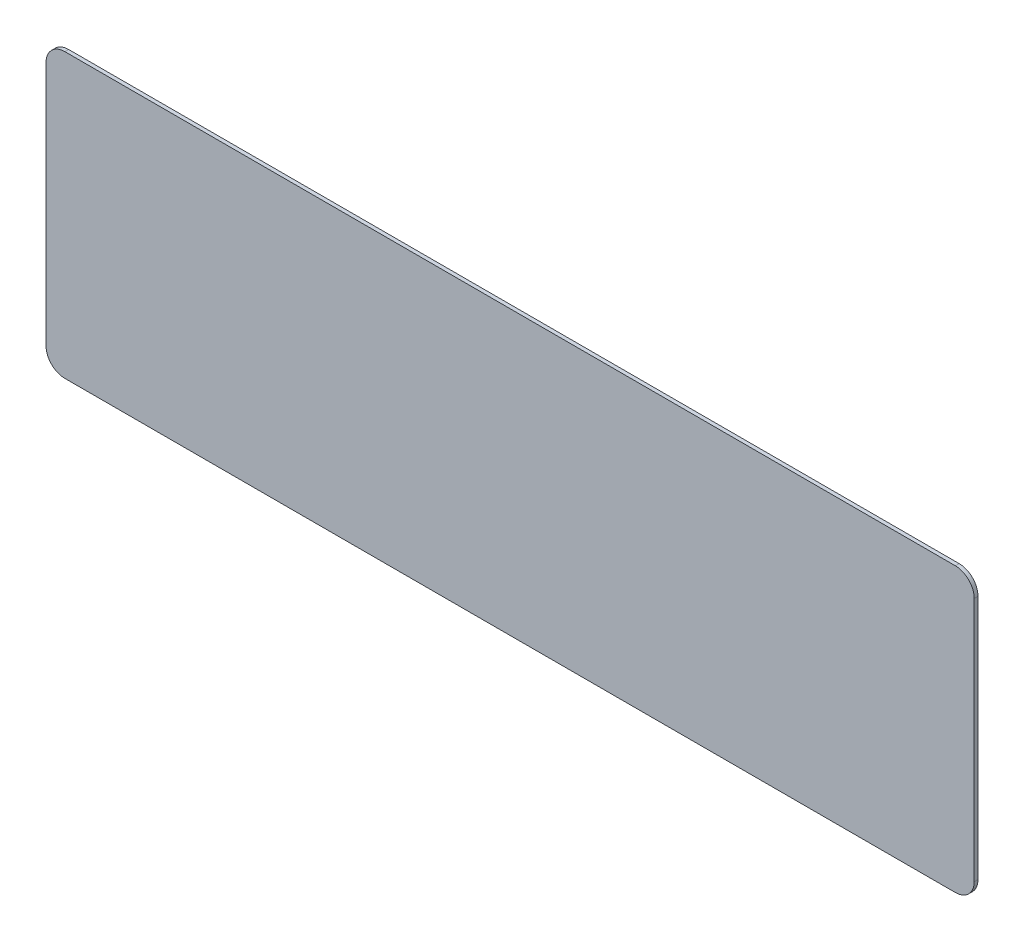
ISO-10303-21;
HEADER;
FILE_DESCRIPTION(('STEP AP214'),'2;1');
FILE_NAME('part.step','',(''),(''),'','','');
FILE_SCHEMA(('AUTOMOTIVE_DESIGN { 1 0 10303 214 1 1 1 1 }'));
ENDSEC;
DATA;
#1=APPLICATION_CONTEXT('core data for automotive mechanical design processes');
#2=APPLICATION_PROTOCOL_DEFINITION('international standard','automotive_design',2000,#1);
#3=PRODUCT_CONTEXT('',#1,'mechanical');
#4=PRODUCT('Part','Part','',(#3));
#5=PRODUCT_RELATED_PRODUCT_CATEGORY('part','',(#4));
#6=PRODUCT_DEFINITION_FORMATION('','',#4);
#7=PRODUCT_DEFINITION_CONTEXT('part definition',#1,'design');
#8=PRODUCT_DEFINITION('design','',#6,#7);
#9=PRODUCT_DEFINITION_SHAPE('','',#8);
#10=(LENGTH_UNIT() NAMED_UNIT(*) SI_UNIT(.MILLI.,.METRE.));
#11=(NAMED_UNIT(*) PLANE_ANGLE_UNIT() SI_UNIT($,.RADIAN.));
#12=(NAMED_UNIT(*) SI_UNIT($,.STERADIAN.) SOLID_ANGLE_UNIT());
#13=UNCERTAINTY_MEASURE_WITH_UNIT(LENGTH_MEASURE(1.E-05),#10,'distance_accuracy_value','');
#14=(GEOMETRIC_REPRESENTATION_CONTEXT(3) GLOBAL_UNCERTAINTY_ASSIGNED_CONTEXT((#13)) GLOBAL_UNIT_ASSIGNED_CONTEXT((#10,
#11,#12)) REPRESENTATION_CONTEXT('',''));
#15=CARTESIAN_POINT('',(0.,0.,0.));
#16=DIRECTION('',(0.,0.,1.));
#17=DIRECTION('',(1.,0.,0.));
#18=AXIS2_PLACEMENT_3D('',#15,#16,#17);
#19=CARTESIAN_POINT('',(-123.000000000036,-367.000000000029,2.));
#20=DIRECTION('',(0.,1.,0.));
#21=DIRECTION('',(0.,0.,1.));
#22=AXIS2_PLACEMENT_3D('',#19,#20,#21);
#23=PLANE('',#22);
#24=DIRECTION('',(1.,0.,0.));
#25=VECTOR('',#24,1.);
#26=CARTESIAN_POINT('',(-123.000000000036,-367.000000000029,2.));
#27=LINE('',#26,#25);
#28=CARTESIAN_POINT('',(-113.000000000036,-367.000000000029,2.));
#29=VERTEX_POINT('',#28);
#30=CARTESIAN_POINT('',(358.999999999964,-367.000000000029,2.));
#31=VERTEX_POINT('',#30);
#32=EDGE_CURVE('E125',#29,#31,#27,.T.);
#33=ORIENTED_EDGE('',*,*,#32,.F.);
#34=DIRECTION('',(0.,0.,-1.));
#35=VECTOR('',#34,1.);
#36=CARTESIAN_POINT('',(-113.000000000036,-367.000000000029,0.));
#37=LINE('',#36,#35);
#38=CARTESIAN_POINT('',(-113.000000000036,-367.000000000029,0.));
#39=VERTEX_POINT('',#38);
#40=EDGE_CURVE('E110',#29,#39,#37,.T.);
#41=ORIENTED_EDGE('',*,*,#40,.T.);
#42=DIRECTION('',(1.,0.,0.));
#43=VECTOR('',#42,1.);
#44=CARTESIAN_POINT('',(-123.000000000036,-367.000000000029,0.));
#45=LINE('',#44,#43);
#46=CARTESIAN_POINT('',(358.999999999964,-367.000000000029,0.));
#47=VERTEX_POINT('',#46);
#48=EDGE_CURVE('E122',#39,#47,#45,.T.);
#49=ORIENTED_EDGE('',*,*,#48,.T.);
#50=DIRECTION('',(0.,0.,-1.));
#51=VECTOR('',#50,1.);
#52=CARTESIAN_POINT('',(358.999999999964,-367.000000000029,2.));
#53=LINE('',#52,#51);
#54=EDGE_CURVE('E127',#47,#31,#53,.F.);
#55=ORIENTED_EDGE('',*,*,#54,.T.);
#56=EDGE_LOOP('',(#33,#41,#49,#55));
#57=FACE_BOUND('',#56,.T.);
#58=ADVANCED_FACE('F40',(#57),#23,.F.);
#59=CARTESIAN_POINT('',(368.999999999964,-367.000000000029,2.));
#60=DIRECTION('',(-1.,0.,0.));
#61=DIRECTION('',(0.,0.,1.));
#62=AXIS2_PLACEMENT_3D('',#59,#60,#61);
#63=PLANE('',#62);
#64=DIRECTION('',(0.,1.,0.));
#65=VECTOR('',#64,1.);
#66=CARTESIAN_POINT('',(368.999999999964,-367.000000000029,2.));
#67=LINE('',#66,#65);
#68=CARTESIAN_POINT('',(368.999999999964,-357.000000000029,2.));
#69=VERTEX_POINT('',#68);
#70=CARTESIAN_POINT('',(368.999999999964,-227.000000000029,2.));
#71=VERTEX_POINT('',#70);
#72=EDGE_CURVE('E169',#69,#71,#67,.T.);
#73=ORIENTED_EDGE('',*,*,#72,.F.);
#74=DIRECTION('',(0.,0.,-1.));
#75=VECTOR('',#74,1.);
#76=CARTESIAN_POINT('',(368.999999999964,-357.000000000029,2.));
#77=LINE('',#76,#75);
#78=CARTESIAN_POINT('',(368.999999999964,-357.000000000029,0.));
#79=VERTEX_POINT('',#78);
#80=EDGE_CURVE('E184',#69,#79,#77,.T.);
#81=ORIENTED_EDGE('',*,*,#80,.T.);
#82=DIRECTION('',(0.,1.,0.));
#83=VECTOR('',#82,1.);
#84=CARTESIAN_POINT('',(368.999999999964,-367.000000000029,0.));
#85=LINE('',#84,#83);
#86=CARTESIAN_POINT('',(368.999999999964,-227.000000000029,0.));
#87=VERTEX_POINT('',#86);
#88=EDGE_CURVE('E131',#79,#87,#85,.T.);
#89=ORIENTED_EDGE('',*,*,#88,.T.);
#90=DIRECTION('',(0.,0.,-1.));
#91=VECTOR('',#90,1.);
#92=CARTESIAN_POINT('',(368.999999999964,-227.000000000029,2.));
#93=LINE('',#92,#91);
#94=EDGE_CURVE('E182',#87,#71,#93,.F.);
#95=ORIENTED_EDGE('',*,*,#94,.T.);
#96=EDGE_LOOP('',(#73,#81,#89,#95));
#97=FACE_BOUND('',#96,.T.);
#98=ADVANCED_FACE('F189',(#97),#63,.F.);
#99=CARTESIAN_POINT('',(-123.000000000036,-217.000000000029,2.));
#100=DIRECTION('',(0.,1.,0.));
#101=DIRECTION('',(-1.,0.,0.));
#102=AXIS2_PLACEMENT_3D('',#99,#100,#101);
#103=PLANE('',#102);
#104=DIRECTION('',(1.,0.,0.));
#105=VECTOR('',#104,1.);
#106=CARTESIAN_POINT('',(-123.000000000036,-217.000000000029,2.));
#107=LINE('',#106,#105);
#108=CARTESIAN_POINT('',(-113.000000000036,-217.000000000029,2.));
#109=VERTEX_POINT('',#108);
#110=CARTESIAN_POINT('',(358.999999999964,-217.000000000029,2.));
#111=VERTEX_POINT('',#110);
#112=EDGE_CURVE('E166',#109,#111,#107,.T.);
#113=ORIENTED_EDGE('',*,*,#112,.T.);
#114=DIRECTION('',(0.,0.,-1.));
#115=VECTOR('',#114,1.);
#116=CARTESIAN_POINT('',(358.999999999964,-217.000000000029,0.));
#117=LINE('',#116,#115);
#118=CARTESIAN_POINT('',(358.999999999964,-217.000000000029,0.));
#119=VERTEX_POINT('',#118);
#120=EDGE_CURVE('E12',#111,#119,#117,.T.);
#121=ORIENTED_EDGE('',*,*,#120,.T.);
#122=DIRECTION('',(1.,0.,0.));
#123=VECTOR('',#122,1.);
#124=CARTESIAN_POINT('',(-123.000000000036,-217.000000000029,0.));
#125=LINE('',#124,#123);
#126=CARTESIAN_POINT('',(-113.000000000036,-217.000000000029,0.));
#127=VERTEX_POINT('',#126);
#128=EDGE_CURVE('E134',#127,#119,#125,.T.);
#129=ORIENTED_EDGE('',*,*,#128,.F.);
#130=DIRECTION('',(0.,0.,-1.));
#131=VECTOR('',#130,1.);
#132=CARTESIAN_POINT('',(-113.000000000036,-217.000000000029,2.));
#133=LINE('',#132,#131);
#134=EDGE_CURVE('E48',#127,#109,#133,.F.);
#135=ORIENTED_EDGE('',*,*,#134,.T.);
#136=EDGE_LOOP('',(#113,#121,#129,#135));
#137=FACE_BOUND('',#136,.T.);
#138=ADVANCED_FACE('F196',(#137),#103,.T.);
#139=CARTESIAN_POINT('',(-123.000000000036,-367.000000000029,2.));
#140=DIRECTION('',(-1.,0.,0.));
#141=DIRECTION('',(0.,0.,1.));
#142=AXIS2_PLACEMENT_3D('',#139,#140,#141);
#143=PLANE('',#142);
#144=DIRECTION('',(0.,1.,0.));
#145=VECTOR('',#144,1.);
#146=CARTESIAN_POINT('',(-123.000000000036,-367.000000000029,0.));
#147=LINE('',#146,#145);
#148=CARTESIAN_POINT('',(-123.000000000036,-357.000000000029,0.));
#149=VERTEX_POINT('',#148);
#150=CARTESIAN_POINT('',(-123.000000000036,-227.000000000029,0.));
#151=VERTEX_POINT('',#150);
#152=EDGE_CURVE('E143',#149,#151,#147,.T.);
#153=ORIENTED_EDGE('',*,*,#152,.F.);
#154=DIRECTION('',(0.,0.,-1.));
#155=VECTOR('',#154,1.);
#156=CARTESIAN_POINT('',(-123.000000000036,-357.000000000029,2.));
#157=LINE('',#156,#155);
#158=CARTESIAN_POINT('',(-123.000000000036,-357.000000000029,2.));
#159=VERTEX_POINT('',#158);
#160=EDGE_CURVE('E111',#149,#159,#157,.F.);
#161=ORIENTED_EDGE('',*,*,#160,.T.);
#162=DIRECTION('',(0.,1.,0.));
#163=VECTOR('',#162,1.);
#164=CARTESIAN_POINT('',(-123.000000000036,-367.000000000029,2.));
#165=LINE('',#164,#163);
#166=CARTESIAN_POINT('',(-123.000000000036,-227.000000000029,2.));
#167=VERTEX_POINT('',#166);
#168=EDGE_CURVE('E137',#159,#167,#165,.T.);
#169=ORIENTED_EDGE('',*,*,#168,.T.);
#170=DIRECTION('',(0.,0.,-1.));
#171=VECTOR('',#170,1.);
#172=CARTESIAN_POINT('',(-123.000000000036,-227.000000000029,2.));
#173=LINE('',#172,#171);
#174=EDGE_CURVE('E116',#167,#151,#173,.T.);
#175=ORIENTED_EDGE('',*,*,#174,.T.);
#176=EDGE_LOOP('',(#153,#161,#169,#175));
#177=FACE_BOUND('',#176,.T.);
#178=ADVANCED_FACE('F204',(#177),#143,.T.);
#179=CARTESIAN_POINT('',(0.,0.,2.));
#180=DIRECTION('',(0.,0.,1.));
#181=DIRECTION('',(1.,0.,0.));
#182=AXIS2_PLACEMENT_3D('',#179,#180,#181);
#183=PLANE('',#182);
#184=ORIENTED_EDGE('',*,*,#168,.F.);
#185=CARTESIAN_POINT('',(-113.000000000036,-357.000000000029,2.));
#186=DIRECTION('',(0.,0.,1.));
#187=DIRECTION('',(1.,0.,0.));
#188=AXIS2_PLACEMENT_3D('',#185,#186,#187);
#189=CIRCLE('',#188,10.);
#190=EDGE_CURVE('E178',#159,#29,#189,.T.);
#191=ORIENTED_EDGE('',*,*,#190,.T.);
#192=ORIENTED_EDGE('',*,*,#32,.T.);
#193=CARTESIAN_POINT('',(358.999999999964,-357.000000000029,2.));
#194=DIRECTION('',(0.,0.,1.));
#195=DIRECTION('',(1.,0.,0.));
#196=AXIS2_PLACEMENT_3D('',#193,#194,#195);
#197=CIRCLE('',#196,10.);
#198=EDGE_CURVE('E159',#31,#69,#197,.T.);
#199=ORIENTED_EDGE('',*,*,#198,.T.);
#200=ORIENTED_EDGE('',*,*,#72,.T.);
#201=CARTESIAN_POINT('',(358.999999999964,-227.000000000029,2.));
#202=DIRECTION('',(0.,0.,1.));
#203=DIRECTION('',(1.,0.,0.));
#204=AXIS2_PLACEMENT_3D('',#201,#202,#203);
#205=CIRCLE('',#204,10.);
#206=EDGE_CURVE('E55',#71,#111,#205,.T.);
#207=ORIENTED_EDGE('',*,*,#206,.T.);
#208=ORIENTED_EDGE('',*,*,#112,.F.);
#209=CARTESIAN_POINT('',(-113.000000000036,-227.000000000029,2.));
#210=DIRECTION('',(0.,0.,1.));
#211=DIRECTION('',(1.,0.,0.));
#212=AXIS2_PLACEMENT_3D('',#209,#210,#211);
#213=CIRCLE('',#212,10.);
#214=EDGE_CURVE('E152',#109,#167,#213,.T.);
#215=ORIENTED_EDGE('',*,*,#214,.T.);
#216=EDGE_LOOP('',(#184,#191,#192,#199,#200,#207,#208,#215));
#217=FACE_BOUND('',#216,.T.);
#218=ADVANCED_FACE('F199',(#217),#183,.T.);
#219=CARTESIAN_POINT('',(0.,0.,0.));
#220=DIRECTION('',(0.,0.,1.));
#221=DIRECTION('',(1.,0.,0.));
#222=AXIS2_PLACEMENT_3D('',#219,#220,#221);
#223=PLANE('',#222);
#224=ORIENTED_EDGE('',*,*,#48,.F.);
#225=CARTESIAN_POINT('',(-113.000000000036,-357.000000000029,0.));
#226=DIRECTION('',(0.,0.,1.));
#227=DIRECTION('',(1.,0.,0.));
#228=AXIS2_PLACEMENT_3D('',#225,#226,#227);
#229=CIRCLE('',#228,10.);
#230=EDGE_CURVE('E106',#39,#149,#229,.F.);
#231=ORIENTED_EDGE('',*,*,#230,.T.);
#232=ORIENTED_EDGE('',*,*,#152,.T.);
#233=CARTESIAN_POINT('',(-113.000000000036,-227.000000000029,0.));
#234=DIRECTION('',(0.,0.,1.));
#235=DIRECTION('',(1.,0.,0.));
#236=AXIS2_PLACEMENT_3D('',#233,#234,#235);
#237=CIRCLE('',#236,10.);
#238=EDGE_CURVE('E126',#151,#127,#237,.F.);
#239=ORIENTED_EDGE('',*,*,#238,.T.);
#240=ORIENTED_EDGE('',*,*,#128,.T.);
#241=CARTESIAN_POINT('',(358.999999999964,-227.000000000029,0.));
#242=DIRECTION('',(0.,0.,1.));
#243=DIRECTION('',(1.,0.,0.));
#244=AXIS2_PLACEMENT_3D('',#241,#242,#243);
#245=CIRCLE('',#244,10.);
#246=EDGE_CURVE('E147',#119,#87,#245,.F.);
#247=ORIENTED_EDGE('',*,*,#246,.T.);
#248=ORIENTED_EDGE('',*,*,#88,.F.);
#249=CARTESIAN_POINT('',(358.999999999964,-357.000000000029,0.));
#250=DIRECTION('',(0.,0.,1.));
#251=DIRECTION('',(1.,0.,0.));
#252=AXIS2_PLACEMENT_3D('',#249,#250,#251);
#253=CIRCLE('',#252,10.);
#254=EDGE_CURVE('E117',#79,#47,#253,.F.);
#255=ORIENTED_EDGE('',*,*,#254,.T.);
#256=EDGE_LOOP('',(#224,#231,#232,#239,#240,#247,#248,#255));
#257=FACE_BOUND('',#256,.T.);
#258=ADVANCED_FACE('F129',(#257),#223,.F.);
#259=CARTESIAN_POINT('',(-113.000000000036,-357.000000000029,2.));
#260=DIRECTION('',(0.,0.,1.));
#261=DIRECTION('',(1.,0.,0.));
#262=AXIS2_PLACEMENT_3D('',#259,#260,#261);
#263=CYLINDRICAL_SURFACE('',#262,10.);
#264=ORIENTED_EDGE('',*,*,#190,.F.);
#265=ORIENTED_EDGE('',*,*,#160,.F.);
#266=ORIENTED_EDGE('',*,*,#230,.F.);
#267=ORIENTED_EDGE('',*,*,#40,.F.);
#268=EDGE_LOOP('',(#264,#265,#266,#267));
#269=FACE_BOUND('',#268,.T.);
#270=ADVANCED_FACE('F109',(#269),#263,.T.);
#271=CARTESIAN_POINT('',(358.999999999964,-357.000000000029,2.));
#272=DIRECTION('',(0.,0.,-1.));
#273=DIRECTION('',(-1.,0.,0.));
#274=AXIS2_PLACEMENT_3D('',#271,#272,#273);
#275=CYLINDRICAL_SURFACE('',#274,10.);
#276=ORIENTED_EDGE('',*,*,#198,.F.);
#277=ORIENTED_EDGE('',*,*,#54,.F.);
#278=ORIENTED_EDGE('',*,*,#254,.F.);
#279=ORIENTED_EDGE('',*,*,#80,.F.);
#280=EDGE_LOOP('',(#276,#277,#278,#279));
#281=FACE_BOUND('',#280,.T.);
#282=ADVANCED_FACE('F207',(#281),#275,.T.);
#283=CARTESIAN_POINT('',(358.999999999964,-227.000000000029,2.));
#284=DIRECTION('',(0.,0.,1.));
#285=DIRECTION('',(1.,0.,0.));
#286=AXIS2_PLACEMENT_3D('',#283,#284,#285);
#287=CYLINDRICAL_SURFACE('',#286,10.);
#288=ORIENTED_EDGE('',*,*,#206,.F.);
#289=ORIENTED_EDGE('',*,*,#94,.F.);
#290=ORIENTED_EDGE('',*,*,#246,.F.);
#291=ORIENTED_EDGE('',*,*,#120,.F.);
#292=EDGE_LOOP('',(#288,#289,#290,#291));
#293=FACE_BOUND('',#292,.T.);
#294=ADVANCED_FACE('F195',(#293),#287,.T.);
#295=CARTESIAN_POINT('',(-113.000000000036,-227.000000000029,2.));
#296=DIRECTION('',(0.,0.,-1.));
#297=DIRECTION('',(-1.,0.,0.));
#298=AXIS2_PLACEMENT_3D('',#295,#296,#297);
#299=CYLINDRICAL_SURFACE('',#298,10.);
#300=ORIENTED_EDGE('',*,*,#214,.F.);
#301=ORIENTED_EDGE('',*,*,#134,.F.);
#302=ORIENTED_EDGE('',*,*,#238,.F.);
#303=ORIENTED_EDGE('',*,*,#174,.F.);
#304=EDGE_LOOP('',(#300,#301,#302,#303));
#305=FACE_BOUND('',#304,.T.);
#306=ADVANCED_FACE('F42',(#305),#299,.T.);
#307=CLOSED_SHELL('',(#58,#98,#138,#178,#218,#258,#270,#282,#294,#306));
#308=MANIFOLD_SOLID_BREP('B2',#307);
#309=ADVANCED_BREP_SHAPE_REPRESENTATION('',(#18,#308),#14);
#310=SHAPE_DEFINITION_REPRESENTATION(#9,#309);
ENDSEC;
END-ISO-10303-21;
